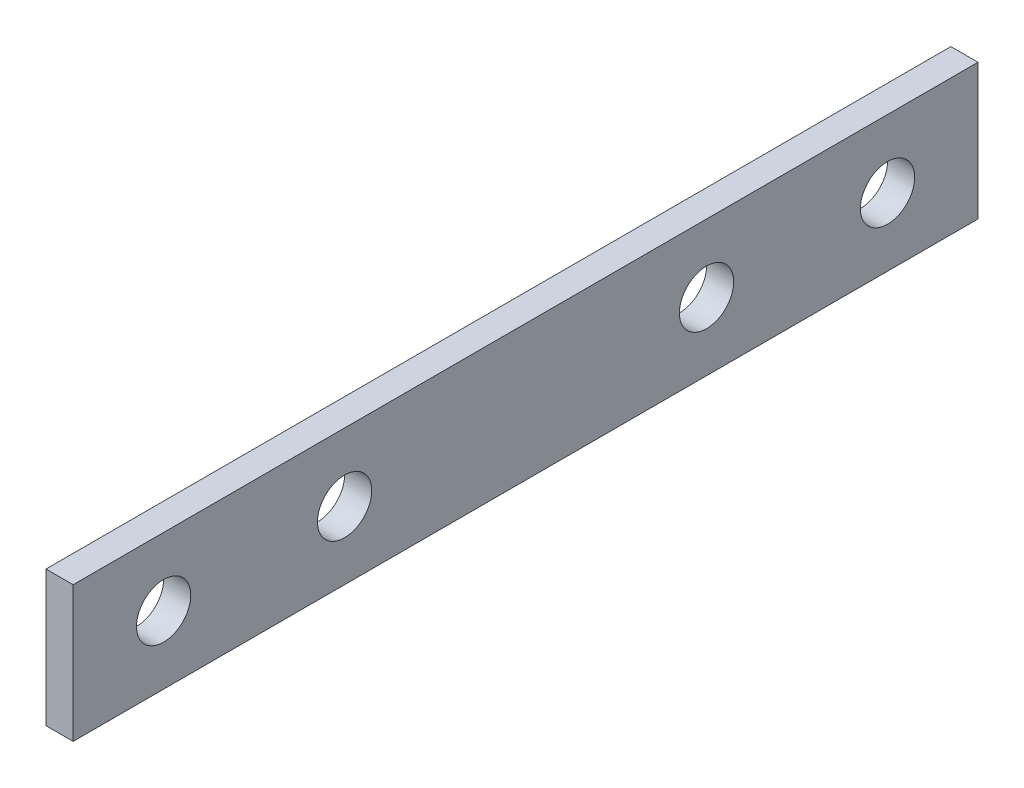
ISO-10303-21;
HEADER;
FILE_DESCRIPTION(('STEP AP214'),'2;1');
FILE_NAME('part.step','',(''),(''),'','','');
FILE_SCHEMA(('AUTOMOTIVE_DESIGN { 1 0 10303 214 1 1 1 1 }'));
ENDSEC;
DATA;
#1=APPLICATION_CONTEXT('core data for automotive mechanical design processes');
#2=APPLICATION_PROTOCOL_DEFINITION('international standard','automotive_design',2000,#1);
#3=PRODUCT_CONTEXT('',#1,'mechanical');
#4=PRODUCT('Part','Part','',(#3));
#5=PRODUCT_RELATED_PRODUCT_CATEGORY('part','',(#4));
#6=PRODUCT_DEFINITION_FORMATION('','',#4);
#7=PRODUCT_DEFINITION_CONTEXT('part definition',#1,'design');
#8=PRODUCT_DEFINITION('design','',#6,#7);
#9=PRODUCT_DEFINITION_SHAPE('','',#8);
#10=(LENGTH_UNIT() NAMED_UNIT(*) SI_UNIT(.MILLI.,.METRE.));
#11=(NAMED_UNIT(*) PLANE_ANGLE_UNIT() SI_UNIT($,.RADIAN.));
#12=(NAMED_UNIT(*) SI_UNIT($,.STERADIAN.) SOLID_ANGLE_UNIT());
#13=UNCERTAINTY_MEASURE_WITH_UNIT(LENGTH_MEASURE(1.E-05),#10,'distance_accuracy_value','');
#14=(GEOMETRIC_REPRESENTATION_CONTEXT(3) GLOBAL_UNCERTAINTY_ASSIGNED_CONTEXT((#13)) GLOBAL_UNIT_ASSIGNED_CONTEXT((#10,
#11,#12)) REPRESENTATION_CONTEXT('',''));
#15=CARTESIAN_POINT('',(0.,0.,0.));
#16=DIRECTION('',(0.,0.,1.));
#17=DIRECTION('',(1.,0.,0.));
#18=AXIS2_PLACEMENT_3D('',#15,#16,#17);
#19=CARTESIAN_POINT('',(3.,0.,0.));
#20=DIRECTION('',(-1.,0.,0.));
#21=DIRECTION('',(0.,0.,1.));
#22=AXIS2_PLACEMENT_3D('',#19,#20,#21);
#23=PLANE('',#22);
#24=DIRECTION('',(0.,1.,0.));
#25=VECTOR('',#24,1.);
#26=CARTESIAN_POINT('',(3.,-7.5,-50.));
#27=LINE('',#26,#25);
#28=CARTESIAN_POINT('',(3.,-7.5,-50.));
#29=VERTEX_POINT('',#28);
#30=CARTESIAN_POINT('',(3.,7.5,-50.));
#31=VERTEX_POINT('',#30);
#32=EDGE_CURVE('E85',#29,#31,#27,.T.);
#33=ORIENTED_EDGE('',*,*,#32,.T.);
#34=DIRECTION('',(0.,0.,1.));
#35=VECTOR('',#34,1.);
#36=CARTESIAN_POINT('',(3.,7.5,50.));
#37=LINE('',#36,#35);
#38=CARTESIAN_POINT('',(3.,7.5,50.));
#39=VERTEX_POINT('',#38);
#40=EDGE_CURVE('E80',#31,#39,#37,.T.);
#41=ORIENTED_EDGE('',*,*,#40,.T.);
#42=DIRECTION('',(0.,-1.,0.));
#43=VECTOR('',#42,1.);
#44=CARTESIAN_POINT('',(3.,-7.5,50.));
#45=LINE('',#44,#43);
#46=CARTESIAN_POINT('',(3.,-7.5,50.));
#47=VERTEX_POINT('',#46);
#48=EDGE_CURVE('E83',#39,#47,#45,.T.);
#49=ORIENTED_EDGE('',*,*,#48,.T.);
#50=DIRECTION('',(0.,0.,-1.));
#51=VECTOR('',#50,1.);
#52=CARTESIAN_POINT('',(3.,-7.5,50.));
#53=LINE('',#52,#51);
#54=EDGE_CURVE('E50',#47,#29,#53,.T.);
#55=ORIENTED_EDGE('',*,*,#54,.T.);
#56=EDGE_LOOP('',(#33,#41,#49,#55));
#57=FACE_BOUND('',#56,.T.);
#58=CARTESIAN_POINT('',(3.,0.,40.));
#59=DIRECTION('',(1.,0.,0.));
#60=DIRECTION('',(0.,0.,-1.));
#61=AXIS2_PLACEMENT_3D('',#58,#59,#60);
#62=CIRCLE('',#61,3.);
#63=CARTESIAN_POINT('',(3.,0.,37.));
#64=VERTEX_POINT('',#63);
#65=EDGE_CURVE('E100',#64,#64,#62,.T.);
#66=ORIENTED_EDGE('',*,*,#65,.F.);
#67=EDGE_LOOP('',(#66));
#68=FACE_BOUND('',#67,.T.);
#69=CARTESIAN_POINT('',(3.,0.,20.));
#70=DIRECTION('',(1.,0.,0.));
#71=DIRECTION('',(0.,0.,-1.));
#72=AXIS2_PLACEMENT_3D('',#69,#70,#71);
#73=CIRCLE('',#72,3.);
#74=CARTESIAN_POINT('',(3.,0.,17.));
#75=VERTEX_POINT('',#74);
#76=EDGE_CURVE('E115',#75,#75,#73,.T.);
#77=ORIENTED_EDGE('',*,*,#76,.F.);
#78=EDGE_LOOP('',(#77));
#79=FACE_BOUND('',#78,.T.);
#80=CARTESIAN_POINT('',(3.,0.,-20.));
#81=DIRECTION('',(1.,0.,0.));
#82=DIRECTION('',(0.,0.,1.));
#83=AXIS2_PLACEMENT_3D('',#80,#81,#82);
#84=CIRCLE('',#83,3.);
#85=CARTESIAN_POINT('',(3.,0.,-17.));
#86=VERTEX_POINT('',#85);
#87=EDGE_CURVE('E121',#86,#86,#84,.T.);
#88=ORIENTED_EDGE('',*,*,#87,.F.);
#89=EDGE_LOOP('',(#88));
#90=FACE_BOUND('',#89,.T.);
#91=CARTESIAN_POINT('',(3.,0.,-40.));
#92=DIRECTION('',(1.,0.,0.));
#93=DIRECTION('',(0.,0.,1.));
#94=AXIS2_PLACEMENT_3D('',#91,#92,#93);
#95=CIRCLE('',#94,3.);
#96=CARTESIAN_POINT('',(3.,0.,-37.));
#97=VERTEX_POINT('',#96);
#98=EDGE_CURVE('E127',#97,#97,#95,.T.);
#99=ORIENTED_EDGE('',*,*,#98,.F.);
#100=EDGE_LOOP('',(#99));
#101=FACE_BOUND('',#100,.T.);
#102=ADVANCED_FACE('F33',(#57,#68,#79,#90,#101),#23,.F.);
#103=CARTESIAN_POINT('',(0.,0.,0.));
#104=DIRECTION('',(-1.,0.,0.));
#105=DIRECTION('',(0.,0.,1.));
#106=AXIS2_PLACEMENT_3D('',#103,#104,#105);
#107=PLANE('',#106);
#108=CARTESIAN_POINT('',(0.,0.,-20.));
#109=DIRECTION('',(1.,0.,0.));
#110=DIRECTION('',(0.,0.,1.));
#111=AXIS2_PLACEMENT_3D('',#108,#109,#110);
#112=CIRCLE('',#111,3.);
#113=CARTESIAN_POINT('',(0.,0.,-17.));
#114=VERTEX_POINT('',#113);
#115=EDGE_CURVE('E124',#114,#114,#112,.T.);
#116=ORIENTED_EDGE('',*,*,#115,.T.);
#117=EDGE_LOOP('',(#116));
#118=FACE_BOUND('',#117,.T.);
#119=CARTESIAN_POINT('',(0.,0.,40.));
#120=DIRECTION('',(1.,0.,0.));
#121=DIRECTION('',(0.,0.,-1.));
#122=AXIS2_PLACEMENT_3D('',#119,#120,#121);
#123=CIRCLE('',#122,3.);
#124=CARTESIAN_POINT('',(0.,0.,37.));
#125=VERTEX_POINT('',#124);
#126=EDGE_CURVE('E112',#125,#125,#123,.T.);
#127=ORIENTED_EDGE('',*,*,#126,.T.);
#128=EDGE_LOOP('',(#127));
#129=FACE_BOUND('',#128,.T.);
#130=DIRECTION('',(0.,1.,0.));
#131=VECTOR('',#130,1.);
#132=CARTESIAN_POINT('',(0.,-7.5,-50.));
#133=LINE('',#132,#131);
#134=CARTESIAN_POINT('',(0.,-7.5,-50.));
#135=VERTEX_POINT('',#134);
#136=CARTESIAN_POINT('',(0.,7.5,-50.));
#137=VERTEX_POINT('',#136);
#138=EDGE_CURVE('E97',#135,#137,#133,.T.);
#139=ORIENTED_EDGE('',*,*,#138,.F.);
#140=DIRECTION('',(0.,0.,-1.));
#141=VECTOR('',#140,1.);
#142=CARTESIAN_POINT('',(0.,-7.5,50.));
#143=LINE('',#142,#141);
#144=CARTESIAN_POINT('',(0.,-7.5,50.));
#145=VERTEX_POINT('',#144);
#146=EDGE_CURVE('E73',#145,#135,#143,.T.);
#147=ORIENTED_EDGE('',*,*,#146,.F.);
#148=DIRECTION('',(0.,-1.,0.));
#149=VECTOR('',#148,1.);
#150=CARTESIAN_POINT('',(0.,-7.5,50.));
#151=LINE('',#150,#149);
#152=CARTESIAN_POINT('',(0.,7.5,50.));
#153=VERTEX_POINT('',#152);
#154=EDGE_CURVE('E67',#153,#145,#151,.T.);
#155=ORIENTED_EDGE('',*,*,#154,.F.);
#156=DIRECTION('',(0.,0.,1.));
#157=VECTOR('',#156,1.);
#158=CARTESIAN_POINT('',(0.,7.5,50.));
#159=LINE('',#158,#157);
#160=EDGE_CURVE('E89',#137,#153,#159,.T.);
#161=ORIENTED_EDGE('',*,*,#160,.F.);
#162=EDGE_LOOP('',(#139,#147,#155,#161));
#163=FACE_BOUND('',#162,.T.);
#164=CARTESIAN_POINT('',(0.,0.,20.));
#165=DIRECTION('',(1.,0.,0.));
#166=DIRECTION('',(0.,0.,-1.));
#167=AXIS2_PLACEMENT_3D('',#164,#165,#166);
#168=CIRCLE('',#167,3.);
#169=CARTESIAN_POINT('',(0.,0.,17.));
#170=VERTEX_POINT('',#169);
#171=EDGE_CURVE('E118',#170,#170,#168,.T.);
#172=ORIENTED_EDGE('',*,*,#171,.T.);
#173=EDGE_LOOP('',(#172));
#174=FACE_BOUND('',#173,.T.);
#175=CARTESIAN_POINT('',(0.,0.,-40.));
#176=DIRECTION('',(1.,0.,0.));
#177=DIRECTION('',(0.,0.,1.));
#178=AXIS2_PLACEMENT_3D('',#175,#176,#177);
#179=CIRCLE('',#178,3.);
#180=CARTESIAN_POINT('',(0.,0.,-37.));
#181=VERTEX_POINT('',#180);
#182=EDGE_CURVE('E130',#181,#181,#179,.T.);
#183=ORIENTED_EDGE('',*,*,#182,.T.);
#184=EDGE_LOOP('',(#183));
#185=FACE_BOUND('',#184,.T.);
#186=ADVANCED_FACE('F108',(#118,#129,#163,#174,#185),#107,.T.);
#187=CARTESIAN_POINT('',(3.,-7.5,-50.));
#188=DIRECTION('',(0.,0.,1.));
#189=DIRECTION('',(1.,0.,0.));
#190=AXIS2_PLACEMENT_3D('',#187,#188,#189);
#191=PLANE('',#190);
#192=ORIENTED_EDGE('',*,*,#138,.T.);
#193=DIRECTION('',(-1.,0.,0.));
#194=VECTOR('',#193,1.);
#195=CARTESIAN_POINT('',(3.,7.5,-50.));
#196=LINE('',#195,#194);
#197=EDGE_CURVE('E11',#31,#137,#196,.T.);
#198=ORIENTED_EDGE('',*,*,#197,.F.);
#199=ORIENTED_EDGE('',*,*,#32,.F.);
#200=DIRECTION('',(-1.,0.,0.));
#201=VECTOR('',#200,1.);
#202=CARTESIAN_POINT('',(3.,-7.5,-50.));
#203=LINE('',#202,#201);
#204=EDGE_CURVE('E93',#29,#135,#203,.T.);
#205=ORIENTED_EDGE('',*,*,#204,.T.);
#206=EDGE_LOOP('',(#192,#198,#199,#205));
#207=FACE_BOUND('',#206,.T.);
#208=ADVANCED_FACE('F35',(#207),#191,.F.);
#209=CARTESIAN_POINT('',(3.,7.5,50.));
#210=DIRECTION('',(0.,-1.,0.));
#211=DIRECTION('',(0.,0.,-1.));
#212=AXIS2_PLACEMENT_3D('',#209,#210,#211);
#213=PLANE('',#212);
#214=ORIENTED_EDGE('',*,*,#160,.T.);
#215=DIRECTION('',(-1.,0.,0.));
#216=VECTOR('',#215,1.);
#217=CARTESIAN_POINT('',(3.,7.5,50.));
#218=LINE('',#217,#216);
#219=EDGE_CURVE('E42',#39,#153,#218,.T.);
#220=ORIENTED_EDGE('',*,*,#219,.F.);
#221=ORIENTED_EDGE('',*,*,#40,.F.);
#222=ORIENTED_EDGE('',*,*,#197,.T.);
#223=EDGE_LOOP('',(#214,#220,#221,#222));
#224=FACE_BOUND('',#223,.T.);
#225=ADVANCED_FACE('F88',(#224),#213,.F.);
#226=CARTESIAN_POINT('',(3.,-7.5,50.));
#227=DIRECTION('',(0.,0.,-1.));
#228=DIRECTION('',(-1.,0.,0.));
#229=AXIS2_PLACEMENT_3D('',#226,#227,#228);
#230=PLANE('',#229);
#231=ORIENTED_EDGE('',*,*,#154,.T.);
#232=DIRECTION('',(-1.,0.,0.));
#233=VECTOR('',#232,1.);
#234=CARTESIAN_POINT('',(3.,-7.5,50.));
#235=LINE('',#234,#233);
#236=EDGE_CURVE('E90',#47,#145,#235,.T.);
#237=ORIENTED_EDGE('',*,*,#236,.F.);
#238=ORIENTED_EDGE('',*,*,#48,.F.);
#239=ORIENTED_EDGE('',*,*,#219,.T.);
#240=EDGE_LOOP('',(#231,#237,#238,#239));
#241=FACE_BOUND('',#240,.T.);
#242=ADVANCED_FACE('F91',(#241),#230,.F.);
#243=CARTESIAN_POINT('',(3.,-7.5,50.));
#244=DIRECTION('',(0.,1.,0.));
#245=DIRECTION('',(0.,0.,1.));
#246=AXIS2_PLACEMENT_3D('',#243,#244,#245);
#247=PLANE('',#246);
#248=ORIENTED_EDGE('',*,*,#146,.T.);
#249=ORIENTED_EDGE('',*,*,#204,.F.);
#250=ORIENTED_EDGE('',*,*,#54,.F.);
#251=ORIENTED_EDGE('',*,*,#236,.T.);
#252=EDGE_LOOP('',(#248,#249,#250,#251));
#253=FACE_BOUND('',#252,.T.);
#254=ADVANCED_FACE('F105',(#253),#247,.F.);
#255=CARTESIAN_POINT('',(3.,0.,40.));
#256=DIRECTION('',(-1.,0.,0.));
#257=DIRECTION('',(0.,0.,1.));
#258=AXIS2_PLACEMENT_3D('',#255,#256,#257);
#259=CYLINDRICAL_SURFACE('',#258,3.);
#260=ORIENTED_EDGE('',*,*,#65,.T.);
#261=EDGE_LOOP('',(#260));
#262=FACE_BOUND('',#261,.T.);
#263=ORIENTED_EDGE('',*,*,#126,.F.);
#264=EDGE_LOOP('',(#263));
#265=FACE_BOUND('',#264,.T.);
#266=ADVANCED_FACE('F147',(#262,#265),#259,.F.);
#267=CARTESIAN_POINT('',(3.,0.,20.));
#268=DIRECTION('',(-1.,0.,0.));
#269=DIRECTION('',(0.,0.,1.));
#270=AXIS2_PLACEMENT_3D('',#267,#268,#269);
#271=CYLINDRICAL_SURFACE('',#270,3.);
#272=ORIENTED_EDGE('',*,*,#76,.T.);
#273=EDGE_LOOP('',(#272));
#274=FACE_BOUND('',#273,.T.);
#275=ORIENTED_EDGE('',*,*,#171,.F.);
#276=EDGE_LOOP('',(#275));
#277=FACE_BOUND('',#276,.T.);
#278=ADVANCED_FACE('F193',(#274,#277),#271,.F.);
#279=CARTESIAN_POINT('',(3.,0.,-20.));
#280=DIRECTION('',(-1.,0.,0.));
#281=DIRECTION('',(0.,0.,1.));
#282=AXIS2_PLACEMENT_3D('',#279,#280,#281);
#283=CYLINDRICAL_SURFACE('',#282,3.);
#284=ORIENTED_EDGE('',*,*,#87,.T.);
#285=EDGE_LOOP('',(#284));
#286=FACE_BOUND('',#285,.T.);
#287=ORIENTED_EDGE('',*,*,#115,.F.);
#288=EDGE_LOOP('',(#287));
#289=FACE_BOUND('',#288,.T.);
#290=ADVANCED_FACE('F201',(#286,#289),#283,.F.);
#291=CARTESIAN_POINT('',(3.,0.,-40.));
#292=DIRECTION('',(-1.,0.,0.));
#293=DIRECTION('',(0.,0.,1.));
#294=AXIS2_PLACEMENT_3D('',#291,#292,#293);
#295=CYLINDRICAL_SURFACE('',#294,3.);
#296=ORIENTED_EDGE('',*,*,#98,.T.);
#297=EDGE_LOOP('',(#296));
#298=FACE_BOUND('',#297,.T.);
#299=ORIENTED_EDGE('',*,*,#182,.F.);
#300=EDGE_LOOP('',(#299));
#301=FACE_BOUND('',#300,.T.);
#302=ADVANCED_FACE('F136',(#298,#301),#295,.F.);
#303=CLOSED_SHELL('',(#102,#186,#208,#225,#242,#254,#266,#278,#290,#302));
#304=MANIFOLD_SOLID_BREP('B2',#303);
#305=ADVANCED_BREP_SHAPE_REPRESENTATION('',(#18,#304),#14);
#306=SHAPE_DEFINITION_REPRESENTATION(#9,#305);
ENDSEC;
END-ISO-10303-21;
